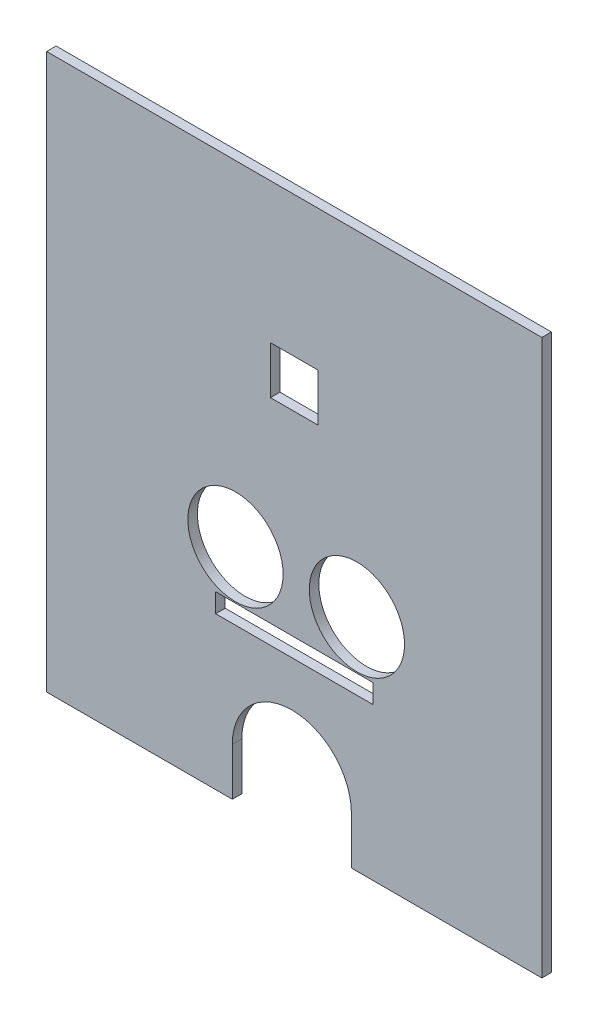
ISO-10303-21;
HEADER;
FILE_DESCRIPTION(('STEP AP214'),'2;1');
FILE_NAME('part.step','',(''),(''),'','','');
FILE_SCHEMA(('AUTOMOTIVE_DESIGN { 1 0 10303 214 1 1 1 1 }'));
ENDSEC;
DATA;
#1=APPLICATION_CONTEXT('core data for automotive mechanical design processes');
#2=APPLICATION_PROTOCOL_DEFINITION('international standard','automotive_design',2000,#1);
#3=PRODUCT_CONTEXT('',#1,'mechanical');
#4=PRODUCT('Part','Part','',(#3));
#5=PRODUCT_RELATED_PRODUCT_CATEGORY('part','',(#4));
#6=PRODUCT_DEFINITION_FORMATION('','',#4);
#7=PRODUCT_DEFINITION_CONTEXT('part definition',#1,'design');
#8=PRODUCT_DEFINITION('design','',#6,#7);
#9=PRODUCT_DEFINITION_SHAPE('','',#8);
#10=(LENGTH_UNIT() NAMED_UNIT(*) SI_UNIT(.MILLI.,.METRE.));
#11=(NAMED_UNIT(*) PLANE_ANGLE_UNIT() SI_UNIT($,.RADIAN.));
#12=(NAMED_UNIT(*) SI_UNIT($,.STERADIAN.) SOLID_ANGLE_UNIT());
#13=UNCERTAINTY_MEASURE_WITH_UNIT(LENGTH_MEASURE(1.E-05),#10,'distance_accuracy_value','');
#14=(GEOMETRIC_REPRESENTATION_CONTEXT(3) GLOBAL_UNCERTAINTY_ASSIGNED_CONTEXT((#13)) GLOBAL_UNIT_ASSIGNED_CONTEXT((#10,
#11,#12)) REPRESENTATION_CONTEXT('',''));
#15=CARTESIAN_POINT('',(0.,0.,0.));
#16=DIRECTION('',(0.,0.,1.));
#17=DIRECTION('',(1.,0.,0.));
#18=AXIS2_PLACEMENT_3D('',#15,#16,#17);
#19=CARTESIAN_POINT('',(0.,0.,2.));
#20=DIRECTION('',(0.,0.,-1.));
#21=DIRECTION('',(-1.,0.,0.));
#22=AXIS2_PLACEMENT_3D('',#19,#20,#21);
#23=PLANE('',#22);
#24=CARTESIAN_POINT('',(-0.499999999999973,15.0000000000013,2.));
#25=DIRECTION('',(0.,0.,1.));
#26=DIRECTION('',(1.,0.,0.));
#27=AXIS2_PLACEMENT_3D('',#24,#25,#26);
#28=CIRCLE('',#27,12.5);
#29=CARTESIAN_POINT('',(12.,15.0000000000013,2.));
#30=VERTEX_POINT('',#29);
#31=CARTESIAN_POINT('',(-13.,15.0000000000013,2.));
#32=VERTEX_POINT('',#31);
#33=EDGE_CURVE('E227',#30,#32,#28,.T.);
#34=ORIENTED_EDGE('',*,*,#33,.F.);
#35=DIRECTION('',(0.,1.,0.));
#36=VECTOR('',#35,1.);
#37=CARTESIAN_POINT('',(12.,15.0000000000013,2.));
#38=LINE('',#37,#36);
#39=CARTESIAN_POINT('',(12.,5.,2.));
#40=VERTEX_POINT('',#39);
#41=EDGE_CURVE('E238',#40,#30,#38,.T.);
#42=ORIENTED_EDGE('',*,*,#41,.F.);
#43=DIRECTION('',(1.,0.,0.));
#44=VECTOR('',#43,1.);
#45=CARTESIAN_POINT('',(-52.0000000000001,5.,2.));
#46=LINE('',#45,#44);
#47=CARTESIAN_POINT('',(51.9999999999999,5.,2.));
#48=VERTEX_POINT('',#47);
#49=EDGE_CURVE('E254',#40,#48,#46,.T.);
#50=ORIENTED_EDGE('',*,*,#49,.T.);
#51=DIRECTION('',(0.,1.,0.));
#52=VECTOR('',#51,1.);
#53=CARTESIAN_POINT('',(51.9999999999999,5.,2.));
#54=LINE('',#53,#52);
#55=CARTESIAN_POINT('',(51.9999999999999,121.5,2.));
#56=VERTEX_POINT('',#55);
#57=EDGE_CURVE('E259',#48,#56,#54,.T.);
#58=ORIENTED_EDGE('',*,*,#57,.T.);
#59=DIRECTION('',(-1.,0.,0.));
#60=VECTOR('',#59,1.);
#61=CARTESIAN_POINT('',(-52.0000000000001,121.5,2.));
#62=LINE('',#61,#60);
#63=CARTESIAN_POINT('',(-52.0000000000001,121.5,2.));
#64=VERTEX_POINT('',#63);
#65=EDGE_CURVE('E261',#56,#64,#62,.T.);
#66=ORIENTED_EDGE('',*,*,#65,.T.);
#67=DIRECTION('',(0.,-1.,0.));
#68=VECTOR('',#67,1.);
#69=CARTESIAN_POINT('',(-52.0000000000001,5.,2.));
#70=LINE('',#69,#68);
#71=CARTESIAN_POINT('',(-52.0000000000001,5.,2.));
#72=VERTEX_POINT('',#71);
#73=EDGE_CURVE('E251',#64,#72,#70,.T.);
#74=ORIENTED_EDGE('',*,*,#73,.T.);
#75=CARTESIAN_POINT('',(-13.,5.,2.));
#76=VERTEX_POINT('',#75);
#77=EDGE_CURVE('E256',#72,#76,#46,.T.);
#78=ORIENTED_EDGE('',*,*,#77,.T.);
#79=DIRECTION('',(0.,-1.,0.));
#80=VECTOR('',#79,1.);
#81=CARTESIAN_POINT('',(-13.,15.0000000000013,2.));
#82=LINE('',#81,#80);
#83=EDGE_CURVE('E236',#32,#76,#82,.T.);
#84=ORIENTED_EDGE('',*,*,#83,.F.);
#85=EDGE_LOOP('',(#34,#42,#50,#58,#66,#74,#78,#84));
#86=FACE_BOUND('',#85,.T.);
#87=DIRECTION('',(1.,0.,0.));
#88=VECTOR('',#87,1.);
#89=CARTESIAN_POINT('',(-16.4981669849044,37.,2.));
#90=LINE('',#89,#88);
#91=CARTESIAN_POINT('',(-16.4981669849044,37.,2.));
#92=VERTEX_POINT('',#91);
#93=CARTESIAN_POINT('',(16.5018330150956,37.,2.));
#94=VERTEX_POINT('',#93);
#95=EDGE_CURVE('E217',#92,#94,#90,.T.);
#96=ORIENTED_EDGE('',*,*,#95,.F.);
#97=DIRECTION('',(0.,-1.,0.));
#98=VECTOR('',#97,1.);
#99=CARTESIAN_POINT('',(-16.4981669849044,41.,2.));
#100=LINE('',#99,#98);
#101=CARTESIAN_POINT('',(-16.4981669849044,41.,2.));
#102=VERTEX_POINT('',#101);
#103=EDGE_CURVE('E193',#102,#92,#100,.T.);
#104=ORIENTED_EDGE('',*,*,#103,.F.);
#105=DIRECTION('',(-1.,0.,0.));
#106=VECTOR('',#105,1.);
#107=CARTESIAN_POINT('',(-16.4981669849044,41.,2.));
#108=LINE('',#107,#106);
#109=CARTESIAN_POINT('',(16.5018330150956,41.,2.));
#110=VERTEX_POINT('',#109);
#111=EDGE_CURVE('E206',#110,#102,#108,.T.);
#112=ORIENTED_EDGE('',*,*,#111,.F.);
#113=DIRECTION('',(0.,1.,0.));
#114=VECTOR('',#113,1.);
#115=CARTESIAN_POINT('',(16.5018330150956,41.,2.));
#116=LINE('',#115,#114);
#117=EDGE_CURVE('E220',#94,#110,#116,.T.);
#118=ORIENTED_EDGE('',*,*,#117,.F.);
#119=EDGE_LOOP('',(#96,#104,#112,#118));
#120=FACE_BOUND('',#119,.T.);
#121=CARTESIAN_POINT('',(13.1599999999974,51.2500000000001,2.));
#122=DIRECTION('',(0.,0.,1.));
#123=DIRECTION('',(1.,0.,0.));
#124=AXIS2_PLACEMENT_3D('',#121,#122,#123);
#125=CIRCLE('',#124,10.);
#126=CARTESIAN_POINT('',(23.1599999999974,51.2500000000001,2.));
#127=VERTEX_POINT('',#126);
#128=EDGE_CURVE('E197',#127,#127,#125,.T.);
#129=ORIENTED_EDGE('',*,*,#128,.F.);
#130=EDGE_LOOP('',(#129));
#131=FACE_BOUND('',#130,.T.);
#132=CARTESIAN_POINT('',(-12.3400000000026,51.2499999999999,2.));
#133=DIRECTION('',(0.,0.,1.));
#134=DIRECTION('',(1.,0.,0.));
#135=AXIS2_PLACEMENT_3D('',#132,#133,#134);
#136=CIRCLE('',#135,10.);
#137=CARTESIAN_POINT('',(-2.34000000000257,51.2499999999999,2.));
#138=VERTEX_POINT('',#137);
#139=EDGE_CURVE('E194',#138,#138,#136,.T.);
#140=ORIENTED_EDGE('',*,*,#139,.F.);
#141=EDGE_LOOP('',(#140));
#142=FACE_BOUND('',#141,.T.);
#143=DIRECTION('',(0.,-1.,0.));
#144=VECTOR('',#143,1.);
#145=CARTESIAN_POINT('',(-5.00000000000008,0.,2.));
#146=LINE('',#145,#144);
#147=CARTESIAN_POINT('',(-5.00000000000008,92.05,2.));
#148=VERTEX_POINT('',#147);
#149=CARTESIAN_POINT('',(-5.00000000000008,82.05,2.));
#150=VERTEX_POINT('',#149);
#151=EDGE_CURVE('E157',#148,#150,#146,.T.);
#152=ORIENTED_EDGE('',*,*,#151,.F.);
#153=DIRECTION('',(1.,0.,0.));
#154=VECTOR('',#153,1.);
#155=CARTESIAN_POINT('',(0.,92.05,2.));
#156=LINE('',#155,#154);
#157=CARTESIAN_POINT('',(4.99999999999992,92.05,2.));
#158=VERTEX_POINT('',#157);
#159=EDGE_CURVE('E166',#148,#158,#156,.T.);
#160=ORIENTED_EDGE('',*,*,#159,.T.);
#161=DIRECTION('',(0.,-1.,0.));
#162=VECTOR('',#161,1.);
#163=CARTESIAN_POINT('',(4.99999999999993,0.,2.));
#164=LINE('',#163,#162);
#165=CARTESIAN_POINT('',(4.99999999999992,82.05,2.));
#166=VERTEX_POINT('',#165);
#167=EDGE_CURVE('E57',#158,#166,#164,.T.);
#168=ORIENTED_EDGE('',*,*,#167,.T.);
#169=DIRECTION('',(1.,0.,0.));
#170=VECTOR('',#169,1.);
#171=CARTESIAN_POINT('',(0.,82.05,2.));
#172=LINE('',#171,#170);
#173=EDGE_CURVE('E163',#150,#166,#172,.T.);
#174=ORIENTED_EDGE('',*,*,#173,.F.);
#175=EDGE_LOOP('',(#152,#160,#168,#174));
#176=FACE_BOUND('',#175,.T.);
#177=ADVANCED_FACE('F42',(#86,#120,#131,#142,#176),#23,.F.);
#178=CARTESIAN_POINT('',(0.,0.,0.));
#179=DIRECTION('',(0.,0.,-1.));
#180=DIRECTION('',(-1.,0.,0.));
#181=AXIS2_PLACEMENT_3D('',#178,#179,#180);
#182=PLANE('',#181);
#183=CARTESIAN_POINT('',(-12.3400000000026,51.2499999999999,0.));
#184=DIRECTION('',(0.,0.,1.));
#185=DIRECTION('',(1.,0.,0.));
#186=AXIS2_PLACEMENT_3D('',#183,#184,#185);
#187=CIRCLE('',#186,10.);
#188=CARTESIAN_POINT('',(-2.34000000000257,51.2499999999999,0.));
#189=VERTEX_POINT('',#188);
#190=EDGE_CURVE('E190',#189,#189,#187,.T.);
#191=ORIENTED_EDGE('',*,*,#190,.T.);
#192=EDGE_LOOP('',(#191));
#193=FACE_BOUND('',#192,.T.);
#194=CARTESIAN_POINT('',(13.1599999999974,51.2500000000001,0.));
#195=DIRECTION('',(0.,0.,1.));
#196=DIRECTION('',(1.,0.,0.));
#197=AXIS2_PLACEMENT_3D('',#194,#195,#196);
#198=CIRCLE('',#197,10.);
#199=CARTESIAN_POINT('',(23.1599999999974,51.2500000000001,0.));
#200=VERTEX_POINT('',#199);
#201=EDGE_CURVE('E186',#200,#200,#198,.T.);
#202=ORIENTED_EDGE('',*,*,#201,.T.);
#203=EDGE_LOOP('',(#202));
#204=FACE_BOUND('',#203,.T.);
#205=DIRECTION('',(0.,-1.,0.));
#206=VECTOR('',#205,1.);
#207=CARTESIAN_POINT('',(-16.4981669849044,41.,0.));
#208=LINE('',#207,#206);
#209=CARTESIAN_POINT('',(-16.4981669849044,41.,0.));
#210=VERTEX_POINT('',#209);
#211=CARTESIAN_POINT('',(-16.4981669849044,37.,0.));
#212=VERTEX_POINT('',#211);
#213=EDGE_CURVE('E202',#210,#212,#208,.T.);
#214=ORIENTED_EDGE('',*,*,#213,.T.);
#215=DIRECTION('',(1.,0.,0.));
#216=VECTOR('',#215,1.);
#217=CARTESIAN_POINT('',(-16.4981669849044,37.,0.));
#218=LINE('',#217,#216);
#219=CARTESIAN_POINT('',(16.5018330150956,37.,0.));
#220=VERTEX_POINT('',#219);
#221=EDGE_CURVE('E205',#212,#220,#218,.T.);
#222=ORIENTED_EDGE('',*,*,#221,.T.);
#223=DIRECTION('',(0.,1.,0.));
#224=VECTOR('',#223,1.);
#225=CARTESIAN_POINT('',(16.5018330150956,41.,0.));
#226=LINE('',#225,#224);
#227=CARTESIAN_POINT('',(16.5018330150956,41.,0.));
#228=VERTEX_POINT('',#227);
#229=EDGE_CURVE('E209',#220,#228,#226,.T.);
#230=ORIENTED_EDGE('',*,*,#229,.T.);
#231=DIRECTION('',(-1.,0.,0.));
#232=VECTOR('',#231,1.);
#233=CARTESIAN_POINT('',(-16.4981669849044,41.,0.));
#234=LINE('',#233,#232);
#235=EDGE_CURVE('E212',#228,#210,#234,.T.);
#236=ORIENTED_EDGE('',*,*,#235,.T.);
#237=EDGE_LOOP('',(#214,#222,#230,#236));
#238=FACE_BOUND('',#237,.T.);
#239=DIRECTION('',(0.,-1.,0.));
#240=VECTOR('',#239,1.);
#241=CARTESIAN_POINT('',(12.,0.,0.));
#242=LINE('',#241,#240);
#243=CARTESIAN_POINT('',(12.,15.0000000000013,0.));
#244=VERTEX_POINT('',#243);
#245=CARTESIAN_POINT('',(12.,5.,0.));
#246=VERTEX_POINT('',#245);
#247=EDGE_CURVE('E11',#244,#246,#242,.T.);
#248=ORIENTED_EDGE('',*,*,#247,.F.);
#249=CARTESIAN_POINT('',(-0.499999999999973,15.0000000000013,0.));
#250=DIRECTION('',(0.,0.,-1.));
#251=DIRECTION('',(-1.,0.,0.));
#252=AXIS2_PLACEMENT_3D('',#249,#250,#251);
#253=CIRCLE('',#252,12.5);
#254=CARTESIAN_POINT('',(-13.,15.0000000000013,0.));
#255=VERTEX_POINT('',#254);
#256=EDGE_CURVE('E50',#255,#244,#253,.T.);
#257=ORIENTED_EDGE('',*,*,#256,.F.);
#258=DIRECTION('',(0.,1.,0.));
#259=VECTOR('',#258,1.);
#260=CARTESIAN_POINT('',(-13.,0.,0.));
#261=LINE('',#260,#259);
#262=CARTESIAN_POINT('',(-13.,5.,0.));
#263=VERTEX_POINT('',#262);
#264=EDGE_CURVE('E284',#263,#255,#261,.T.);
#265=ORIENTED_EDGE('',*,*,#264,.F.);
#266=DIRECTION('',(1.,0.,0.));
#267=VECTOR('',#266,1.);
#268=CARTESIAN_POINT('',(-52.0000000000001,5.,0.));
#269=LINE('',#268,#267);
#270=CARTESIAN_POINT('',(-52.0000000000001,5.,0.));
#271=VERTEX_POINT('',#270);
#272=EDGE_CURVE('E267',#271,#263,#269,.T.);
#273=ORIENTED_EDGE('',*,*,#272,.F.);
#274=DIRECTION('',(0.,-1.,0.));
#275=VECTOR('',#274,1.);
#276=CARTESIAN_POINT('',(-52.0000000000001,5.,0.));
#277=LINE('',#276,#275);
#278=CARTESIAN_POINT('',(-52.0000000000001,121.5,0.));
#279=VERTEX_POINT('',#278);
#280=EDGE_CURVE('E244',#279,#271,#277,.T.);
#281=ORIENTED_EDGE('',*,*,#280,.F.);
#282=DIRECTION('',(-1.,0.,0.));
#283=VECTOR('',#282,1.);
#284=CARTESIAN_POINT('',(-52.0000000000001,121.5,0.));
#285=LINE('',#284,#283);
#286=CARTESIAN_POINT('',(51.9999999999999,121.5,0.));
#287=VERTEX_POINT('',#286);
#288=EDGE_CURVE('E255',#287,#279,#285,.T.);
#289=ORIENTED_EDGE('',*,*,#288,.F.);
#290=DIRECTION('',(0.,1.,0.));
#291=VECTOR('',#290,1.);
#292=CARTESIAN_POINT('',(51.9999999999999,5.,0.));
#293=LINE('',#292,#291);
#294=CARTESIAN_POINT('',(51.9999999999999,5.,0.));
#295=VERTEX_POINT('',#294);
#296=EDGE_CURVE('E270',#295,#287,#293,.T.);
#297=ORIENTED_EDGE('',*,*,#296,.F.);
#298=EDGE_CURVE('E266',#246,#295,#269,.T.);
#299=ORIENTED_EDGE('',*,*,#298,.F.);
#300=EDGE_LOOP('',(#248,#257,#265,#273,#281,#289,#297,#299));
#301=FACE_BOUND('',#300,.T.);
#302=DIRECTION('',(1.,0.,0.));
#303=VECTOR('',#302,1.);
#304=CARTESIAN_POINT('',(0.,92.05,0.));
#305=LINE('',#304,#303);
#306=CARTESIAN_POINT('',(-5.00000000000008,92.05,0.));
#307=VERTEX_POINT('',#306);
#308=CARTESIAN_POINT('',(4.99999999999992,92.05,0.));
#309=VERTEX_POINT('',#308);
#310=EDGE_CURVE('E180',#307,#309,#305,.T.);
#311=ORIENTED_EDGE('',*,*,#310,.F.);
#312=DIRECTION('',(0.,-1.,0.));
#313=VECTOR('',#312,1.);
#314=CARTESIAN_POINT('',(-5.00000000000008,0.,0.));
#315=LINE('',#314,#313);
#316=CARTESIAN_POINT('',(-5.00000000000008,82.05,0.));
#317=VERTEX_POINT('',#316);
#318=EDGE_CURVE('E65',#307,#317,#315,.T.);
#319=ORIENTED_EDGE('',*,*,#318,.T.);
#320=DIRECTION('',(1.,0.,0.));
#321=VECTOR('',#320,1.);
#322=CARTESIAN_POINT('',(0.,82.05,0.));
#323=LINE('',#322,#321);
#324=CARTESIAN_POINT('',(4.99999999999992,82.05,0.));
#325=VERTEX_POINT('',#324);
#326=EDGE_CURVE('E171',#317,#325,#323,.T.);
#327=ORIENTED_EDGE('',*,*,#326,.T.);
#328=DIRECTION('',(0.,-1.,0.));
#329=VECTOR('',#328,1.);
#330=CARTESIAN_POINT('',(4.99999999999993,0.,0.));
#331=LINE('',#330,#329);
#332=EDGE_CURVE('E174',#309,#325,#331,.T.);
#333=ORIENTED_EDGE('',*,*,#332,.F.);
#334=EDGE_LOOP('',(#311,#319,#327,#333));
#335=FACE_BOUND('',#334,.T.);
#336=ADVANCED_FACE('F299',(#193,#204,#238,#301,#335),#182,.T.);
#337=CARTESIAN_POINT('',(-52.0000000000001,5.,2.));
#338=DIRECTION('',(0.,1.,0.));
#339=DIRECTION('',(0.,0.,1.));
#340=AXIS2_PLACEMENT_3D('',#337,#338,#339);
#341=PLANE('',#340);
#342=ORIENTED_EDGE('',*,*,#49,.F.);
#343=DIRECTION('',(0.,0.,1.));
#344=VECTOR('',#343,1.);
#345=CARTESIAN_POINT('',(12.,5.,-2.));
#346=LINE('',#345,#344);
#347=EDGE_CURVE('E245',#246,#40,#346,.T.);
#348=ORIENTED_EDGE('',*,*,#347,.F.);
#349=ORIENTED_EDGE('',*,*,#298,.T.);
#350=DIRECTION('',(0.,0.,-1.));
#351=VECTOR('',#350,1.);
#352=CARTESIAN_POINT('',(51.9999999999999,5.,2.));
#353=LINE('',#352,#351);
#354=EDGE_CURVE('E278',#48,#295,#353,.T.);
#355=ORIENTED_EDGE('',*,*,#354,.F.);
#356=EDGE_LOOP('',(#342,#348,#349,#355));
#357=FACE_BOUND('',#356,.T.);
#358=ADVANCED_FACE('F306',(#357),#341,.F.);
#359=CARTESIAN_POINT('',(-52.0000000000001,5.,2.));
#360=DIRECTION('',(1.,0.,0.));
#361=DIRECTION('',(0.,0.,-1.));
#362=AXIS2_PLACEMENT_3D('',#359,#360,#361);
#363=PLANE('',#362);
#364=ORIENTED_EDGE('',*,*,#280,.T.);
#365=DIRECTION('',(0.,0.,-1.));
#366=VECTOR('',#365,1.);
#367=CARTESIAN_POINT('',(-52.0000000000001,5.,2.));
#368=LINE('',#367,#366);
#369=EDGE_CURVE('E281',#72,#271,#368,.T.);
#370=ORIENTED_EDGE('',*,*,#369,.F.);
#371=ORIENTED_EDGE('',*,*,#73,.F.);
#372=DIRECTION('',(0.,0.,-1.));
#373=VECTOR('',#372,1.);
#374=CARTESIAN_POINT('',(-52.0000000000001,121.5,2.));
#375=LINE('',#374,#373);
#376=EDGE_CURVE('E263',#64,#279,#375,.T.);
#377=ORIENTED_EDGE('',*,*,#376,.T.);
#378=EDGE_LOOP('',(#364,#370,#371,#377));
#379=FACE_BOUND('',#378,.T.);
#380=ADVANCED_FACE('F44',(#379),#363,.F.);
#381=ORIENTED_EDGE('',*,*,#272,.T.);
#382=DIRECTION('',(0.,0.,1.));
#383=VECTOR('',#382,1.);
#384=CARTESIAN_POINT('',(-13.,5.,-2.));
#385=LINE('',#384,#383);
#386=EDGE_CURVE('E247',#263,#76,#385,.T.);
#387=ORIENTED_EDGE('',*,*,#386,.T.);
#388=ORIENTED_EDGE('',*,*,#77,.F.);
#389=ORIENTED_EDGE('',*,*,#369,.T.);
#390=EDGE_LOOP('',(#381,#387,#388,#389));
#391=FACE_BOUND('',#390,.T.);
#392=ADVANCED_FACE('F319',(#391),#341,.F.);
#393=CARTESIAN_POINT('',(51.9999999999999,5.,2.));
#394=DIRECTION('',(-1.,0.,0.));
#395=DIRECTION('',(0.,0.,1.));
#396=AXIS2_PLACEMENT_3D('',#393,#394,#395);
#397=PLANE('',#396);
#398=ORIENTED_EDGE('',*,*,#296,.T.);
#399=DIRECTION('',(0.,0.,-1.));
#400=VECTOR('',#399,1.);
#401=CARTESIAN_POINT('',(51.9999999999999,121.5,2.));
#402=LINE('',#401,#400);
#403=EDGE_CURVE('E275',#56,#287,#402,.T.);
#404=ORIENTED_EDGE('',*,*,#403,.F.);
#405=ORIENTED_EDGE('',*,*,#57,.F.);
#406=ORIENTED_EDGE('',*,*,#354,.T.);
#407=EDGE_LOOP('',(#398,#404,#405,#406));
#408=FACE_BOUND('',#407,.T.);
#409=ADVANCED_FACE('F309',(#408),#397,.F.);
#410=CARTESIAN_POINT('',(-52.0000000000001,121.5,2.));
#411=DIRECTION('',(0.,-1.,0.));
#412=DIRECTION('',(0.,0.,-1.));
#413=AXIS2_PLACEMENT_3D('',#410,#411,#412);
#414=PLANE('',#413);
#415=ORIENTED_EDGE('',*,*,#288,.T.);
#416=ORIENTED_EDGE('',*,*,#376,.F.);
#417=ORIENTED_EDGE('',*,*,#65,.F.);
#418=ORIENTED_EDGE('',*,*,#403,.T.);
#419=EDGE_LOOP('',(#415,#416,#417,#418));
#420=FACE_BOUND('',#419,.T.);
#421=ADVANCED_FACE('F325',(#420),#414,.F.);
#422=CARTESIAN_POINT('',(-0.499999999999973,15.0000000000013,-2.));
#423=DIRECTION('',(0.,0.,1.));
#424=DIRECTION('',(1.,0.,0.));
#425=AXIS2_PLACEMENT_3D('',#422,#423,#424);
#426=CYLINDRICAL_SURFACE('',#425,12.5);
#427=ORIENTED_EDGE('',*,*,#256,.T.);
#428=DIRECTION('',(0.,0.,1.));
#429=VECTOR('',#428,1.);
#430=CARTESIAN_POINT('',(12.,15.0000000000013,-2.));
#431=LINE('',#430,#429);
#432=EDGE_CURVE('E242',#244,#30,#431,.T.);
#433=ORIENTED_EDGE('',*,*,#432,.T.);
#434=ORIENTED_EDGE('',*,*,#33,.T.);
#435=DIRECTION('',(0.,0.,1.));
#436=VECTOR('',#435,1.);
#437=CARTESIAN_POINT('',(-13.,15.0000000000013,-2.));
#438=LINE('',#437,#436);
#439=EDGE_CURVE('E241',#255,#32,#438,.T.);
#440=ORIENTED_EDGE('',*,*,#439,.F.);
#441=EDGE_LOOP('',(#427,#433,#434,#440));
#442=FACE_BOUND('',#441,.T.);
#443=ADVANCED_FACE('F289',(#442),#426,.F.);
#444=CARTESIAN_POINT('',(12.,15.0000000000013,-2.));
#445=DIRECTION('',(1.,0.,0.));
#446=DIRECTION('',(0.,1.,0.));
#447=AXIS2_PLACEMENT_3D('',#444,#445,#446);
#448=PLANE('',#447);
#449=ORIENTED_EDGE('',*,*,#247,.T.);
#450=ORIENTED_EDGE('',*,*,#347,.T.);
#451=ORIENTED_EDGE('',*,*,#41,.T.);
#452=ORIENTED_EDGE('',*,*,#432,.F.);
#453=EDGE_LOOP('',(#449,#450,#451,#452));
#454=FACE_BOUND('',#453,.T.);
#455=ADVANCED_FACE('F294',(#454),#448,.F.);
#456=CARTESIAN_POINT('',(-13.,15.0000000000013,-2.));
#457=DIRECTION('',(-1.,0.,0.));
#458=DIRECTION('',(0.,-1.,0.));
#459=AXIS2_PLACEMENT_3D('',#456,#457,#458);
#460=PLANE('',#459);
#461=ORIENTED_EDGE('',*,*,#264,.T.);
#462=ORIENTED_EDGE('',*,*,#439,.T.);
#463=ORIENTED_EDGE('',*,*,#83,.T.);
#464=ORIENTED_EDGE('',*,*,#386,.F.);
#465=EDGE_LOOP('',(#461,#462,#463,#464));
#466=FACE_BOUND('',#465,.T.);
#467=ADVANCED_FACE('F317',(#466),#460,.F.);
#468=CARTESIAN_POINT('',(-16.4981669849044,41.,0.));
#469=DIRECTION('',(-1.,0.,0.));
#470=DIRECTION('',(0.,0.,1.));
#471=AXIS2_PLACEMENT_3D('',#468,#469,#470);
#472=PLANE('',#471);
#473=ORIENTED_EDGE('',*,*,#103,.T.);
#474=DIRECTION('',(0.,0.,1.));
#475=VECTOR('',#474,1.);
#476=CARTESIAN_POINT('',(-16.4981669849044,37.,0.));
#477=LINE('',#476,#475);
#478=EDGE_CURVE('E215',#212,#92,#477,.T.);
#479=ORIENTED_EDGE('',*,*,#478,.F.);
#480=ORIENTED_EDGE('',*,*,#213,.F.);
#481=DIRECTION('',(0.,0.,1.));
#482=VECTOR('',#481,1.);
#483=CARTESIAN_POINT('',(-16.4981669849044,41.,0.));
#484=LINE('',#483,#482);
#485=EDGE_CURVE('E225',#210,#102,#484,.T.);
#486=ORIENTED_EDGE('',*,*,#485,.T.);
#487=EDGE_LOOP('',(#473,#479,#480,#486));
#488=FACE_BOUND('',#487,.T.);
#489=ADVANCED_FACE('F344',(#488),#472,.F.);
#490=CARTESIAN_POINT('',(-16.4981669849044,41.,0.));
#491=DIRECTION('',(0.,1.,0.));
#492=DIRECTION('',(0.,0.,1.));
#493=AXIS2_PLACEMENT_3D('',#490,#491,#492);
#494=PLANE('',#493);
#495=ORIENTED_EDGE('',*,*,#111,.T.);
#496=ORIENTED_EDGE('',*,*,#485,.F.);
#497=ORIENTED_EDGE('',*,*,#235,.F.);
#498=DIRECTION('',(0.,0.,1.));
#499=VECTOR('',#498,1.);
#500=CARTESIAN_POINT('',(16.5018330150956,41.,0.));
#501=LINE('',#500,#499);
#502=EDGE_CURVE('E228',#228,#110,#501,.T.);
#503=ORIENTED_EDGE('',*,*,#502,.T.);
#504=EDGE_LOOP('',(#495,#496,#497,#503));
#505=FACE_BOUND('',#504,.T.);
#506=ADVANCED_FACE('F349',(#505),#494,.F.);
#507=CARTESIAN_POINT('',(16.5018330150956,41.,0.));
#508=DIRECTION('',(1.,0.,0.));
#509=DIRECTION('',(0.,0.,-1.));
#510=AXIS2_PLACEMENT_3D('',#507,#508,#509);
#511=PLANE('',#510);
#512=ORIENTED_EDGE('',*,*,#117,.T.);
#513=ORIENTED_EDGE('',*,*,#502,.F.);
#514=ORIENTED_EDGE('',*,*,#229,.F.);
#515=DIRECTION('',(0.,0.,1.));
#516=VECTOR('',#515,1.);
#517=CARTESIAN_POINT('',(16.5018330150956,37.,0.));
#518=LINE('',#517,#516);
#519=EDGE_CURVE('E230',#220,#94,#518,.T.);
#520=ORIENTED_EDGE('',*,*,#519,.T.);
#521=EDGE_LOOP('',(#512,#513,#514,#520));
#522=FACE_BOUND('',#521,.T.);
#523=ADVANCED_FACE('F355',(#522),#511,.F.);
#524=CARTESIAN_POINT('',(-16.4981669849044,37.,0.));
#525=DIRECTION('',(0.,-1.,0.));
#526=DIRECTION('',(0.,0.,-1.));
#527=AXIS2_PLACEMENT_3D('',#524,#525,#526);
#528=PLANE('',#527);
#529=ORIENTED_EDGE('',*,*,#95,.T.);
#530=ORIENTED_EDGE('',*,*,#519,.F.);
#531=ORIENTED_EDGE('',*,*,#221,.F.);
#532=ORIENTED_EDGE('',*,*,#478,.T.);
#533=EDGE_LOOP('',(#529,#530,#531,#532));
#534=FACE_BOUND('',#533,.T.);
#535=ADVANCED_FACE('F351',(#534),#528,.F.);
#536=CARTESIAN_POINT('',(13.1599999999974,51.2500000000001,0.));
#537=DIRECTION('',(0.,0.,1.));
#538=DIRECTION('',(1.,0.,0.));
#539=AXIS2_PLACEMENT_3D('',#536,#537,#538);
#540=CYLINDRICAL_SURFACE('',#539,10.);
#541=ORIENTED_EDGE('',*,*,#201,.F.);
#542=EDGE_LOOP('',(#541));
#543=FACE_BOUND('',#542,.T.);
#544=ORIENTED_EDGE('',*,*,#128,.T.);
#545=EDGE_LOOP('',(#544));
#546=FACE_BOUND('',#545,.T.);
#547=ADVANCED_FACE('F354',(#543,#546),#540,.F.);
#548=CARTESIAN_POINT('',(-12.3400000000026,51.2499999999999,0.));
#549=DIRECTION('',(0.,0.,1.));
#550=DIRECTION('',(1.,0.,0.));
#551=AXIS2_PLACEMENT_3D('',#548,#549,#550);
#552=CYLINDRICAL_SURFACE('',#551,10.);
#553=ORIENTED_EDGE('',*,*,#190,.F.);
#554=EDGE_LOOP('',(#553));
#555=FACE_BOUND('',#554,.T.);
#556=ORIENTED_EDGE('',*,*,#139,.T.);
#557=EDGE_LOOP('',(#556));
#558=FACE_BOUND('',#557,.T.);
#559=ADVANCED_FACE('F365',(#555,#558),#552,.F.);
#560=CARTESIAN_POINT('',(-5.00000000000008,0.,2.));
#561=DIRECTION('',(1.,0.,0.));
#562=DIRECTION('',(0.,0.,-1.));
#563=AXIS2_PLACEMENT_3D('',#560,#561,#562);
#564=PLANE('',#563);
#565=ORIENTED_EDGE('',*,*,#318,.F.);
#566=DIRECTION('',(0.,0.,-1.));
#567=VECTOR('',#566,1.);
#568=CARTESIAN_POINT('',(-5.00000000000008,92.05,2.));
#569=LINE('',#568,#567);
#570=EDGE_CURVE('E153',#148,#307,#569,.T.);
#571=ORIENTED_EDGE('',*,*,#570,.F.);
#572=ORIENTED_EDGE('',*,*,#151,.T.);
#573=DIRECTION('',(0.,0.,-1.));
#574=VECTOR('',#573,1.);
#575=CARTESIAN_POINT('',(-5.00000000000008,82.05,2.));
#576=LINE('',#575,#574);
#577=EDGE_CURVE('E184',#150,#317,#576,.T.);
#578=ORIENTED_EDGE('',*,*,#577,.T.);
#579=EDGE_LOOP('',(#565,#571,#572,#578));
#580=FACE_BOUND('',#579,.T.);
#581=ADVANCED_FACE('F155',(#580),#564,.T.);
#582=CARTESIAN_POINT('',(0.,82.05,2.));
#583=DIRECTION('',(0.,1.,0.));
#584=DIRECTION('',(0.,0.,1.));
#585=AXIS2_PLACEMENT_3D('',#582,#583,#584);
#586=PLANE('',#585);
#587=ORIENTED_EDGE('',*,*,#326,.F.);
#588=ORIENTED_EDGE('',*,*,#577,.F.);
#589=ORIENTED_EDGE('',*,*,#173,.T.);
#590=DIRECTION('',(0.,0.,-1.));
#591=VECTOR('',#590,1.);
#592=CARTESIAN_POINT('',(4.99999999999992,82.05,2.));
#593=LINE('',#592,#591);
#594=EDGE_CURVE('E187',#166,#325,#593,.T.);
#595=ORIENTED_EDGE('',*,*,#594,.T.);
#596=EDGE_LOOP('',(#587,#588,#589,#595));
#597=FACE_BOUND('',#596,.T.);
#598=ADVANCED_FACE('F372',(#597),#586,.T.);
#599=CARTESIAN_POINT('',(4.99999999999993,0.,2.));
#600=DIRECTION('',(1.,0.,0.));
#601=DIRECTION('',(0.,1.,0.));
#602=AXIS2_PLACEMENT_3D('',#599,#600,#601);
#603=PLANE('',#602);
#604=ORIENTED_EDGE('',*,*,#332,.T.);
#605=ORIENTED_EDGE('',*,*,#594,.F.);
#606=ORIENTED_EDGE('',*,*,#167,.F.);
#607=DIRECTION('',(0.,0.,-1.));
#608=VECTOR('',#607,1.);
#609=CARTESIAN_POINT('',(4.99999999999992,92.05,2.));
#610=LINE('',#609,#608);
#611=EDGE_CURVE('E162',#158,#309,#610,.T.);
#612=ORIENTED_EDGE('',*,*,#611,.T.);
#613=EDGE_LOOP('',(#604,#605,#606,#612));
#614=FACE_BOUND('',#613,.T.);
#615=ADVANCED_FACE('F375',(#614),#603,.F.);
#616=CARTESIAN_POINT('',(0.,92.05,2.));
#617=DIRECTION('',(0.,1.,0.));
#618=DIRECTION('',(0.,0.,1.));
#619=AXIS2_PLACEMENT_3D('',#616,#617,#618);
#620=PLANE('',#619);
#621=ORIENTED_EDGE('',*,*,#310,.T.);
#622=ORIENTED_EDGE('',*,*,#611,.F.);
#623=ORIENTED_EDGE('',*,*,#159,.F.);
#624=ORIENTED_EDGE('',*,*,#570,.T.);
#625=EDGE_LOOP('',(#621,#622,#623,#624));
#626=FACE_BOUND('',#625,.T.);
#627=ADVANCED_FACE('F167',(#626),#620,.F.);
#628=CLOSED_SHELL('',(#177,#336,#358,#380,#392,#409,#421,#443,#455,#467,#489,#506,#523,#535,
#547,#559,#581,#598,#615,#627));
#629=MANIFOLD_SOLID_BREP('B2',#628);
#630=ADVANCED_BREP_SHAPE_REPRESENTATION('',(#18,#629),#14);
#631=SHAPE_DEFINITION_REPRESENTATION(#9,#630);
ENDSEC;
END-ISO-10303-21;
